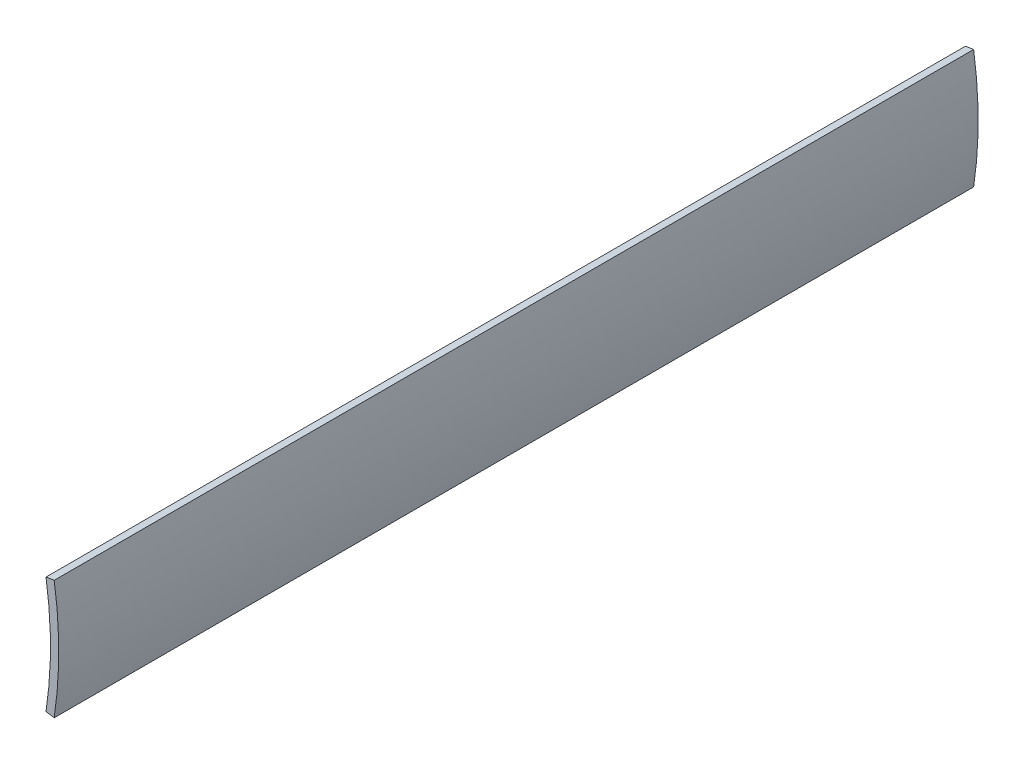
ISO-10303-21;
HEADER;
FILE_DESCRIPTION(('STEP AP214'),'2;1');
FILE_NAME('part.step','',(''),(''),'','','');
FILE_SCHEMA(('AUTOMOTIVE_DESIGN { 1 0 10303 214 1 1 1 1 }'));
ENDSEC;
DATA;
#1=APPLICATION_CONTEXT('core data for automotive mechanical design processes');
#2=APPLICATION_PROTOCOL_DEFINITION('international standard','automotive_design',2000,#1);
#3=PRODUCT_CONTEXT('',#1,'mechanical');
#4=PRODUCT('Part','Part','',(#3));
#5=PRODUCT_RELATED_PRODUCT_CATEGORY('part','',(#4));
#6=PRODUCT_DEFINITION_FORMATION('','',#4);
#7=PRODUCT_DEFINITION_CONTEXT('part definition',#1,'design');
#8=PRODUCT_DEFINITION('design','',#6,#7);
#9=PRODUCT_DEFINITION_SHAPE('','',#8);
#10=(LENGTH_UNIT() NAMED_UNIT(*) SI_UNIT(.MILLI.,.METRE.));
#11=(NAMED_UNIT(*) PLANE_ANGLE_UNIT() SI_UNIT($,.RADIAN.));
#12=(NAMED_UNIT(*) SI_UNIT($,.STERADIAN.) SOLID_ANGLE_UNIT());
#13=UNCERTAINTY_MEASURE_WITH_UNIT(LENGTH_MEASURE(1.E-05),#10,'distance_accuracy_value','');
#14=(GEOMETRIC_REPRESENTATION_CONTEXT(3) GLOBAL_UNCERTAINTY_ASSIGNED_CONTEXT((#13)) GLOBAL_UNIT_ASSIGNED_CONTEXT((#10,
#11,#12)) REPRESENTATION_CONTEXT('',''));
#15=CARTESIAN_POINT('',(0.,0.,0.));
#16=DIRECTION('',(0.,0.,1.));
#17=DIRECTION('',(1.,0.,0.));
#18=AXIS2_PLACEMENT_3D('',#15,#16,#17);
#19=CARTESIAN_POINT('',(0.,0.,1800.));
#20=DIRECTION('',(0.,0.,-1.));
#21=DIRECTION('',(-1.,0.,0.));
#22=AXIS2_PLACEMENT_3D('',#19,#20,#21);
#23=CYLINDRICAL_SURFACE('',#22,750.);
#24=CARTESIAN_POINT('',(0.,0.,0.));
#25=DIRECTION('',(0.,0.,-1.));
#26=DIRECTION('',(1.,0.,0.));
#27=AXIS2_PLACEMENT_3D('',#24,#25,#26);
#28=CIRCLE('',#27,750.);
#29=CARTESIAN_POINT('',(741.271132850821,114.092539642437,0.));
#30=VERTEX_POINT('',#29);
#31=CARTESIAN_POINT('',(741.271132850821,-114.092539642437,0.));
#32=VERTEX_POINT('',#31);
#33=EDGE_CURVE('E107',#30,#32,#28,.T.);
#34=ORIENTED_EDGE('',*,*,#33,.T.);
#35=DIRECTION('',(0.,0.,-1.));
#36=VECTOR('',#35,1.);
#37=CARTESIAN_POINT('',(741.271132850821,-114.092539642437,1800.));
#38=LINE('',#37,#36);
#39=CARTESIAN_POINT('',(741.271132850821,-114.092539642437,1800.));
#40=VERTEX_POINT('',#39);
#41=EDGE_CURVE('E11',#40,#32,#38,.T.);
#42=ORIENTED_EDGE('',*,*,#41,.F.);
#43=CARTESIAN_POINT('',(0.,0.,1800.));
#44=DIRECTION('',(0.,0.,-1.));
#45=DIRECTION('',(1.,0.,0.));
#46=AXIS2_PLACEMENT_3D('',#43,#44,#45);
#47=CIRCLE('',#46,750.);
#48=CARTESIAN_POINT('',(741.271132850821,114.092539642437,1800.));
#49=VERTEX_POINT('',#48);
#50=EDGE_CURVE('E91',#49,#40,#47,.T.);
#51=ORIENTED_EDGE('',*,*,#50,.F.);
#52=DIRECTION('',(0.,0.,-1.));
#53=VECTOR('',#52,1.);
#54=CARTESIAN_POINT('',(741.271132850821,114.092539642437,1800.));
#55=LINE('',#54,#53);
#56=EDGE_CURVE('E103',#49,#30,#55,.T.);
#57=ORIENTED_EDGE('',*,*,#56,.T.);
#58=EDGE_LOOP('',(#34,#42,#51,#57));
#59=FACE_BOUND('',#58,.T.);
#60=ADVANCED_FACE('F39',(#59),#23,.F.);
#61=CARTESIAN_POINT('',(741.271132850821,-114.092539642437,1800.));
#62=DIRECTION('',(0.152123386189911,0.988361510467762,0.));
#63=DIRECTION('',(-0.988361510467762,0.152123386189911,0.));
#64=AXIS2_PLACEMENT_3D('',#61,#62,#63);
#65=PLANE('',#64);
#66=DIRECTION('',(0.988361510467762,-0.152123386189911,0.));
#67=VECTOR('',#66,1.);
#68=CARTESIAN_POINT('',(741.271132850821,-114.092539642437,0.));
#69=LINE('',#68,#67);
#70=CARTESIAN_POINT('',(757.332007395922,-116.564544668023,0.));
#71=VERTEX_POINT('',#70);
#72=EDGE_CURVE('E96',#32,#71,#69,.T.);
#73=ORIENTED_EDGE('',*,*,#72,.T.);
#74=DIRECTION('',(0.,0.,-1.));
#75=VECTOR('',#74,1.);
#76=CARTESIAN_POINT('',(757.332007395922,-116.564544668023,1800.));
#77=LINE('',#76,#75);
#78=CARTESIAN_POINT('',(757.332007395922,-116.564544668023,1800.));
#79=VERTEX_POINT('',#78);
#80=EDGE_CURVE('E48',#79,#71,#77,.T.);
#81=ORIENTED_EDGE('',*,*,#80,.F.);
#82=DIRECTION('',(0.988361510467762,-0.152123386189911,0.));
#83=VECTOR('',#82,1.);
#84=CARTESIAN_POINT('',(741.271132850821,-114.092539642437,1800.));
#85=LINE('',#84,#83);
#86=EDGE_CURVE('E86',#40,#79,#85,.T.);
#87=ORIENTED_EDGE('',*,*,#86,.F.);
#88=ORIENTED_EDGE('',*,*,#41,.T.);
#89=EDGE_LOOP('',(#73,#81,#87,#88));
#90=FACE_BOUND('',#89,.T.);
#91=ADVANCED_FACE('F95',(#90),#65,.F.);
#92=CARTESIAN_POINT('',(0.,0.,1800.));
#93=DIRECTION('',(0.,0.,-1.));
#94=DIRECTION('',(-1.,0.,0.));
#95=AXIS2_PLACEMENT_3D('',#92,#93,#94);
#96=CYLINDRICAL_SURFACE('',#95,766.250000000001);
#97=CARTESIAN_POINT('',(0.,0.,0.));
#98=DIRECTION('',(0.,0.,1.));
#99=DIRECTION('',(1.,0.,0.));
#100=AXIS2_PLACEMENT_3D('',#97,#98,#99);
#101=CIRCLE('',#100,766.250000000001);
#102=CARTESIAN_POINT('',(757.332007395922,116.564544668023,0.));
#103=VERTEX_POINT('',#102);
#104=EDGE_CURVE('E73',#71,#103,#101,.T.);
#105=ORIENTED_EDGE('',*,*,#104,.T.);
#106=DIRECTION('',(0.,0.,-1.));
#107=VECTOR('',#106,1.);
#108=CARTESIAN_POINT('',(757.332007395922,116.564544668023,1800.));
#109=LINE('',#108,#107);
#110=CARTESIAN_POINT('',(757.332007395922,116.564544668023,1800.));
#111=VERTEX_POINT('',#110);
#112=EDGE_CURVE('E98',#111,#103,#109,.T.);
#113=ORIENTED_EDGE('',*,*,#112,.F.);
#114=CARTESIAN_POINT('',(0.,0.,1800.));
#115=DIRECTION('',(0.,0.,1.));
#116=DIRECTION('',(1.,0.,0.));
#117=AXIS2_PLACEMENT_3D('',#114,#115,#116);
#118=CIRCLE('',#117,766.250000000001);
#119=EDGE_CURVE('E89',#79,#111,#118,.T.);
#120=ORIENTED_EDGE('',*,*,#119,.F.);
#121=ORIENTED_EDGE('',*,*,#80,.T.);
#122=EDGE_LOOP('',(#105,#113,#120,#121));
#123=FACE_BOUND('',#122,.T.);
#124=ADVANCED_FACE('F99',(#123),#96,.T.);
#125=CARTESIAN_POINT('',(741.271132850821,114.092539642437,1800.));
#126=DIRECTION('',(0.152123386189918,-0.988361510467761,0.));
#127=DIRECTION('',(0.988361510467761,0.152123386189918,0.));
#128=AXIS2_PLACEMENT_3D('',#125,#126,#127);
#129=PLANE('',#128);
#130=DIRECTION('',(-0.988361510467761,-0.152123386189918,0.));
#131=VECTOR('',#130,1.);
#132=CARTESIAN_POINT('',(741.271132850821,114.092539642437,0.));
#133=LINE('',#132,#131);
#134=EDGE_CURVE('E79',#103,#30,#133,.T.);
#135=ORIENTED_EDGE('',*,*,#134,.T.);
#136=ORIENTED_EDGE('',*,*,#56,.F.);
#137=DIRECTION('',(-0.988361510467761,-0.152123386189918,0.));
#138=VECTOR('',#137,1.);
#139=CARTESIAN_POINT('',(741.271132850821,114.092539642437,1800.));
#140=LINE('',#139,#138);
#141=EDGE_CURVE('E56',#111,#49,#140,.T.);
#142=ORIENTED_EDGE('',*,*,#141,.F.);
#143=ORIENTED_EDGE('',*,*,#112,.T.);
#144=EDGE_LOOP('',(#135,#136,#142,#143));
#145=FACE_BOUND('',#144,.T.);
#146=ADVANCED_FACE('F120',(#145),#129,.F.);
#147=CARTESIAN_POINT('',(0.,0.,1800.));
#148=DIRECTION('',(0.,0.,1.));
#149=DIRECTION('',(1.,0.,0.));
#150=AXIS2_PLACEMENT_3D('',#147,#148,#149);
#151=PLANE('',#150);
#152=ORIENTED_EDGE('',*,*,#50,.T.);
#153=ORIENTED_EDGE('',*,*,#86,.T.);
#154=ORIENTED_EDGE('',*,*,#119,.T.);
#155=ORIENTED_EDGE('',*,*,#141,.T.);
#156=EDGE_LOOP('',(#152,#153,#154,#155));
#157=FACE_BOUND('',#156,.T.);
#158=ADVANCED_FACE('F87',(#157),#151,.T.);
#159=CARTESIAN_POINT('',(0.,0.,0.));
#160=DIRECTION('',(0.,0.,1.));
#161=DIRECTION('',(1.,0.,0.));
#162=AXIS2_PLACEMENT_3D('',#159,#160,#161);
#163=PLANE('',#162);
#164=ORIENTED_EDGE('',*,*,#33,.F.);
#165=ORIENTED_EDGE('',*,*,#134,.F.);
#166=ORIENTED_EDGE('',*,*,#104,.F.);
#167=ORIENTED_EDGE('',*,*,#72,.F.);
#168=EDGE_LOOP('',(#164,#165,#166,#167));
#169=FACE_BOUND('',#168,.T.);
#170=ADVANCED_FACE('F123',(#169),#163,.F.);
#171=CLOSED_SHELL('',(#60,#91,#124,#146,#158,#170));
#172=MANIFOLD_SOLID_BREP('B2',#171);
#173=ADVANCED_BREP_SHAPE_REPRESENTATION('',(#18,#172),#14);
#174=SHAPE_DEFINITION_REPRESENTATION(#9,#173);
ENDSEC;
END-ISO-10303-21;
